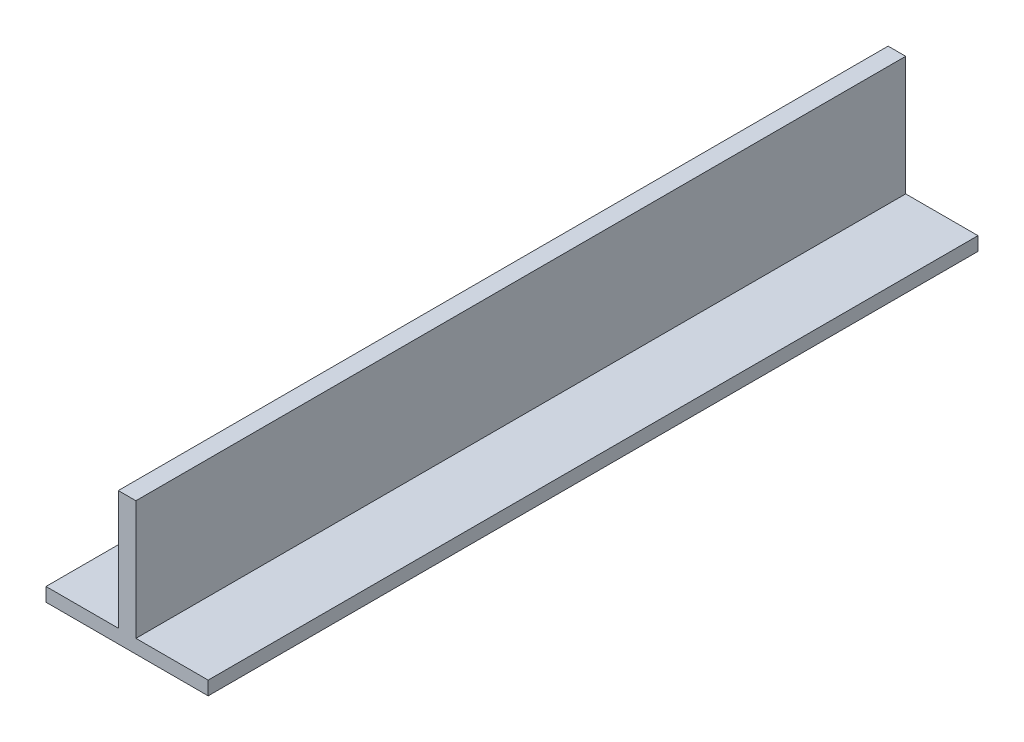
ISO-10303-21;
HEADER;
FILE_DESCRIPTION(('STEP AP214'),'2;1');
FILE_NAME('part.step','',(''),(''),'','','');
FILE_SCHEMA(('AUTOMOTIVE_DESIGN { 1 0 10303 214 1 1 1 1 }'));
ENDSEC;
DATA;
#1=APPLICATION_CONTEXT('core data for automotive mechanical design processes');
#2=APPLICATION_PROTOCOL_DEFINITION('international standard','automotive_design',2000,#1);
#3=PRODUCT_CONTEXT('',#1,'mechanical');
#4=PRODUCT('Part','Part','',(#3));
#5=PRODUCT_RELATED_PRODUCT_CATEGORY('part','',(#4));
#6=PRODUCT_DEFINITION_FORMATION('','',#4);
#7=PRODUCT_DEFINITION_CONTEXT('part definition',#1,'design');
#8=PRODUCT_DEFINITION('design','',#6,#7);
#9=PRODUCT_DEFINITION_SHAPE('','',#8);
#10=(LENGTH_UNIT() NAMED_UNIT(*) SI_UNIT(.MILLI.,.METRE.));
#11=(NAMED_UNIT(*) PLANE_ANGLE_UNIT() SI_UNIT($,.RADIAN.));
#12=(NAMED_UNIT(*) SI_UNIT($,.STERADIAN.) SOLID_ANGLE_UNIT());
#13=UNCERTAINTY_MEASURE_WITH_UNIT(LENGTH_MEASURE(1.E-05),#10,'distance_accuracy_value','');
#14=(GEOMETRIC_REPRESENTATION_CONTEXT(3) GLOBAL_UNCERTAINTY_ASSIGNED_CONTEXT((#13)) GLOBAL_UNIT_ASSIGNED_CONTEXT((#10,
#11,#12)) REPRESENTATION_CONTEXT('',''));
#15=CARTESIAN_POINT('',(0.,0.,0.));
#16=DIRECTION('',(0.,0.,1.));
#17=DIRECTION('',(1.,0.,0.));
#18=AXIS2_PLACEMENT_3D('',#15,#16,#17);
#19=CARTESIAN_POINT('',(0.,7.,394.));
#20=DIRECTION('',(1.,0.,0.));
#21=DIRECTION('',(0.,0.,-1.));
#22=AXIS2_PLACEMENT_3D('',#19,#20,#21);
#23=PLANE('',#22);
#24=DIRECTION('',(0.,-1.,0.));
#25=VECTOR('',#24,1.);
#26=CARTESIAN_POINT('',(0.,7.,0.));
#27=LINE('',#26,#25);
#28=CARTESIAN_POINT('',(0.,7.,0.));
#29=VERTEX_POINT('',#28);
#30=CARTESIAN_POINT('',(0.,0.,0.));
#31=VERTEX_POINT('',#30);
#32=EDGE_CURVE('E128',#29,#31,#27,.T.);
#33=ORIENTED_EDGE('',*,*,#32,.T.);
#34=DIRECTION('',(0.,0.,-1.));
#35=VECTOR('',#34,1.);
#36=CARTESIAN_POINT('',(0.,0.,394.));
#37=LINE('',#36,#35);
#38=CARTESIAN_POINT('',(0.,0.,394.));
#39=VERTEX_POINT('',#38);
#40=EDGE_CURVE('E11',#39,#31,#37,.T.);
#41=ORIENTED_EDGE('',*,*,#40,.F.);
#42=DIRECTION('',(0.,-1.,0.));
#43=VECTOR('',#42,1.);
#44=CARTESIAN_POINT('',(0.,7.,394.));
#45=LINE('',#44,#43);
#46=CARTESIAN_POINT('',(0.,7.,394.));
#47=VERTEX_POINT('',#46);
#48=EDGE_CURVE('E142',#47,#39,#45,.T.);
#49=ORIENTED_EDGE('',*,*,#48,.F.);
#50=DIRECTION('',(0.,0.,-1.));
#51=VECTOR('',#50,1.);
#52=CARTESIAN_POINT('',(0.,7.,394.));
#53=LINE('',#52,#51);
#54=EDGE_CURVE('E124',#47,#29,#53,.T.);
#55=ORIENTED_EDGE('',*,*,#54,.T.);
#56=EDGE_LOOP('',(#33,#41,#49,#55));
#57=FACE_BOUND('',#56,.T.);
#58=ADVANCED_FACE('F32',(#57),#23,.F.);
#59=CARTESIAN_POINT('',(0.,0.,394.));
#60=DIRECTION('',(0.,1.,0.));
#61=DIRECTION('',(0.,0.,1.));
#62=AXIS2_PLACEMENT_3D('',#59,#60,#61);
#63=PLANE('',#62);
#64=DIRECTION('',(1.,0.,0.));
#65=VECTOR('',#64,1.);
#66=CARTESIAN_POINT('',(0.,0.,0.));
#67=LINE('',#66,#65);
#68=CARTESIAN_POINT('',(83.,0.,0.));
#69=VERTEX_POINT('',#68);
#70=EDGE_CURVE('E131',#31,#69,#67,.T.);
#71=ORIENTED_EDGE('',*,*,#70,.T.);
#72=DIRECTION('',(0.,0.,-1.));
#73=VECTOR('',#72,1.);
#74=CARTESIAN_POINT('',(83.,0.,394.));
#75=LINE('',#74,#73);
#76=CARTESIAN_POINT('',(83.,0.,394.));
#77=VERTEX_POINT('',#76);
#78=EDGE_CURVE('E40',#77,#69,#75,.T.);
#79=ORIENTED_EDGE('',*,*,#78,.F.);
#80=DIRECTION('',(1.,0.,0.));
#81=VECTOR('',#80,1.);
#82=CARTESIAN_POINT('',(0.,0.,394.));
#83=LINE('',#82,#81);
#84=EDGE_CURVE('E91',#39,#77,#83,.T.);
#85=ORIENTED_EDGE('',*,*,#84,.F.);
#86=ORIENTED_EDGE('',*,*,#40,.T.);
#87=EDGE_LOOP('',(#71,#79,#85,#86));
#88=FACE_BOUND('',#87,.T.);
#89=ADVANCED_FACE('F177',(#88),#63,.F.);
#90=CARTESIAN_POINT('',(83.,0.,394.));
#91=DIRECTION('',(-1.,0.,0.));
#92=DIRECTION('',(0.,0.,1.));
#93=AXIS2_PLACEMENT_3D('',#90,#91,#92);
#94=PLANE('',#93);
#95=DIRECTION('',(0.,1.,0.));
#96=VECTOR('',#95,1.);
#97=CARTESIAN_POINT('',(83.,0.,0.));
#98=LINE('',#97,#96);
#99=CARTESIAN_POINT('',(83.,7.,0.));
#100=VERTEX_POINT('',#99);
#101=EDGE_CURVE('E133',#69,#100,#98,.T.);
#102=ORIENTED_EDGE('',*,*,#101,.T.);
#103=DIRECTION('',(0.,0.,-1.));
#104=VECTOR('',#103,1.);
#105=CARTESIAN_POINT('',(83.,7.,394.));
#106=LINE('',#105,#104);
#107=CARTESIAN_POINT('',(83.,7.,394.));
#108=VERTEX_POINT('',#107);
#109=EDGE_CURVE('E149',#108,#100,#106,.T.);
#110=ORIENTED_EDGE('',*,*,#109,.F.);
#111=DIRECTION('',(0.,1.,0.));
#112=VECTOR('',#111,1.);
#113=CARTESIAN_POINT('',(83.,0.,394.));
#114=LINE('',#113,#112);
#115=EDGE_CURVE('E157',#77,#108,#114,.T.);
#116=ORIENTED_EDGE('',*,*,#115,.F.);
#117=ORIENTED_EDGE('',*,*,#78,.T.);
#118=EDGE_LOOP('',(#102,#110,#116,#117));
#119=FACE_BOUND('',#118,.T.);
#120=ADVANCED_FACE('F155',(#119),#94,.F.);
#121=CARTESIAN_POINT('',(83.,7.,394.));
#122=DIRECTION('',(0.,-1.,0.));
#123=DIRECTION('',(0.,0.,-1.));
#124=AXIS2_PLACEMENT_3D('',#121,#122,#123);
#125=PLANE('',#124);
#126=DIRECTION('',(-1.,0.,0.));
#127=VECTOR('',#126,1.);
#128=CARTESIAN_POINT('',(83.,7.,0.));
#129=LINE('',#128,#127);
#130=CARTESIAN_POINT('',(46.,7.,0.));
#131=VERTEX_POINT('',#130);
#132=EDGE_CURVE('E135',#100,#131,#129,.T.);
#133=ORIENTED_EDGE('',*,*,#132,.T.);
#134=DIRECTION('',(0.,0.,-1.));
#135=VECTOR('',#134,1.);
#136=CARTESIAN_POINT('',(46.,7.,394.));
#137=LINE('',#136,#135);
#138=CARTESIAN_POINT('',(46.,7.,394.));
#139=VERTEX_POINT('',#138);
#140=EDGE_CURVE('E146',#139,#131,#137,.T.);
#141=ORIENTED_EDGE('',*,*,#140,.F.);
#142=DIRECTION('',(-1.,0.,0.));
#143=VECTOR('',#142,1.);
#144=CARTESIAN_POINT('',(83.,7.,394.));
#145=LINE('',#144,#143);
#146=EDGE_CURVE('E169',#108,#139,#145,.T.);
#147=ORIENTED_EDGE('',*,*,#146,.F.);
#148=ORIENTED_EDGE('',*,*,#109,.T.);
#149=EDGE_LOOP('',(#133,#141,#147,#148));
#150=FACE_BOUND('',#149,.T.);
#151=ADVANCED_FACE('F165',(#150),#125,.F.);
#152=CARTESIAN_POINT('',(46.,7.,394.));
#153=DIRECTION('',(-1.,0.,0.));
#154=DIRECTION('',(0.,-1.,0.));
#155=AXIS2_PLACEMENT_3D('',#152,#153,#154);
#156=PLANE('',#155);
#157=DIRECTION('',(0.,1.,0.));
#158=VECTOR('',#157,1.);
#159=CARTESIAN_POINT('',(46.,7.,0.));
#160=LINE('',#159,#158);
#161=CARTESIAN_POINT('',(46.,68.,0.));
#162=VERTEX_POINT('',#161);
#163=EDGE_CURVE('E137',#131,#162,#160,.T.);
#164=ORIENTED_EDGE('',*,*,#163,.T.);
#165=DIRECTION('',(0.,0.,-1.));
#166=VECTOR('',#165,1.);
#167=CARTESIAN_POINT('',(46.,68.,394.));
#168=LINE('',#167,#166);
#169=CARTESIAN_POINT('',(46.,68.,394.));
#170=VERTEX_POINT('',#169);
#171=EDGE_CURVE('E119',#170,#162,#168,.T.);
#172=ORIENTED_EDGE('',*,*,#171,.F.);
#173=DIRECTION('',(0.,1.,0.));
#174=VECTOR('',#173,1.);
#175=CARTESIAN_POINT('',(46.,7.,394.));
#176=LINE('',#175,#174);
#177=EDGE_CURVE('E110',#139,#170,#176,.T.);
#178=ORIENTED_EDGE('',*,*,#177,.F.);
#179=ORIENTED_EDGE('',*,*,#140,.T.);
#180=EDGE_LOOP('',(#164,#172,#178,#179));
#181=FACE_BOUND('',#180,.T.);
#182=ADVANCED_FACE('F168',(#181),#156,.F.);
#183=CARTESIAN_POINT('',(46.,68.,394.));
#184=DIRECTION('',(0.,-1.,0.));
#185=DIRECTION('',(0.,0.,-1.));
#186=AXIS2_PLACEMENT_3D('',#183,#184,#185);
#187=PLANE('',#186);
#188=DIRECTION('',(-1.,0.,0.));
#189=VECTOR('',#188,1.);
#190=CARTESIAN_POINT('',(46.,68.,0.));
#191=LINE('',#190,#189);
#192=CARTESIAN_POINT('',(37.,68.,0.));
#193=VERTEX_POINT('',#192);
#194=EDGE_CURVE('E118',#162,#193,#191,.T.);
#195=ORIENTED_EDGE('',*,*,#194,.T.);
#196=DIRECTION('',(0.,0.,-1.));
#197=VECTOR('',#196,1.);
#198=CARTESIAN_POINT('',(37.,68.,394.));
#199=LINE('',#198,#197);
#200=CARTESIAN_POINT('',(37.,68.,394.));
#201=VERTEX_POINT('',#200);
#202=EDGE_CURVE('E115',#201,#193,#199,.T.);
#203=ORIENTED_EDGE('',*,*,#202,.F.);
#204=DIRECTION('',(-1.,0.,0.));
#205=VECTOR('',#204,1.);
#206=CARTESIAN_POINT('',(46.,68.,394.));
#207=LINE('',#206,#205);
#208=EDGE_CURVE('E104',#170,#201,#207,.T.);
#209=ORIENTED_EDGE('',*,*,#208,.F.);
#210=ORIENTED_EDGE('',*,*,#171,.T.);
#211=EDGE_LOOP('',(#195,#203,#209,#210));
#212=FACE_BOUND('',#211,.T.);
#213=ADVANCED_FACE('F116',(#212),#187,.F.);
#214=CARTESIAN_POINT('',(37.,68.,394.));
#215=DIRECTION('',(1.,0.,0.));
#216=DIRECTION('',(0.,0.,-1.));
#217=AXIS2_PLACEMENT_3D('',#214,#215,#216);
#218=PLANE('',#217);
#219=DIRECTION('',(0.,-1.,0.));
#220=VECTOR('',#219,1.);
#221=CARTESIAN_POINT('',(37.,68.,0.));
#222=LINE('',#221,#220);
#223=CARTESIAN_POINT('',(37.,7.,0.));
#224=VERTEX_POINT('',#223);
#225=EDGE_CURVE('E77',#193,#224,#222,.T.);
#226=ORIENTED_EDGE('',*,*,#225,.T.);
#227=DIRECTION('',(0.,0.,-1.));
#228=VECTOR('',#227,1.);
#229=CARTESIAN_POINT('',(37.,7.,394.));
#230=LINE('',#229,#228);
#231=CARTESIAN_POINT('',(37.,7.,394.));
#232=VERTEX_POINT('',#231);
#233=EDGE_CURVE('E120',#232,#224,#230,.T.);
#234=ORIENTED_EDGE('',*,*,#233,.F.);
#235=DIRECTION('',(0.,-1.,0.));
#236=VECTOR('',#235,1.);
#237=CARTESIAN_POINT('',(37.,68.,394.));
#238=LINE('',#237,#236);
#239=EDGE_CURVE('E108',#201,#232,#238,.T.);
#240=ORIENTED_EDGE('',*,*,#239,.F.);
#241=ORIENTED_EDGE('',*,*,#202,.T.);
#242=EDGE_LOOP('',(#226,#234,#240,#241));
#243=FACE_BOUND('',#242,.T.);
#244=ADVANCED_FACE('F122',(#243),#218,.F.);
#245=CARTESIAN_POINT('',(37.,7.,394.));
#246=DIRECTION('',(0.,-1.,0.));
#247=DIRECTION('',(1.,0.,0.));
#248=AXIS2_PLACEMENT_3D('',#245,#246,#247);
#249=PLANE('',#248);
#250=DIRECTION('',(-1.,0.,0.));
#251=VECTOR('',#250,1.);
#252=CARTESIAN_POINT('',(37.,7.,0.));
#253=LINE('',#252,#251);
#254=EDGE_CURVE('E83',#224,#29,#253,.T.);
#255=ORIENTED_EDGE('',*,*,#254,.T.);
#256=ORIENTED_EDGE('',*,*,#54,.F.);
#257=DIRECTION('',(-1.,0.,0.));
#258=VECTOR('',#257,1.);
#259=CARTESIAN_POINT('',(37.,7.,394.));
#260=LINE('',#259,#258);
#261=EDGE_CURVE('E48',#232,#47,#260,.T.);
#262=ORIENTED_EDGE('',*,*,#261,.F.);
#263=ORIENTED_EDGE('',*,*,#233,.T.);
#264=EDGE_LOOP('',(#255,#256,#262,#263));
#265=FACE_BOUND('',#264,.T.);
#266=ADVANCED_FACE('F193',(#265),#249,.F.);
#267=CARTESIAN_POINT('',(0.,0.,394.));
#268=DIRECTION('',(0.,0.,1.));
#269=DIRECTION('',(1.,0.,0.));
#270=AXIS2_PLACEMENT_3D('',#267,#268,#269);
#271=PLANE('',#270);
#272=ORIENTED_EDGE('',*,*,#48,.T.);
#273=ORIENTED_EDGE('',*,*,#84,.T.);
#274=ORIENTED_EDGE('',*,*,#115,.T.);
#275=ORIENTED_EDGE('',*,*,#146,.T.);
#276=ORIENTED_EDGE('',*,*,#177,.T.);
#277=ORIENTED_EDGE('',*,*,#208,.T.);
#278=ORIENTED_EDGE('',*,*,#239,.T.);
#279=ORIENTED_EDGE('',*,*,#261,.T.);
#280=EDGE_LOOP('',(#272,#273,#274,#275,#276,#277,#278,#279));
#281=FACE_BOUND('',#280,.T.);
#282=ADVANCED_FACE('F106',(#281),#271,.T.);
#283=CARTESIAN_POINT('',(0.,0.,0.));
#284=DIRECTION('',(0.,0.,1.));
#285=DIRECTION('',(1.,0.,0.));
#286=AXIS2_PLACEMENT_3D('',#283,#284,#285);
#287=PLANE('',#286);
#288=ORIENTED_EDGE('',*,*,#32,.F.);
#289=ORIENTED_EDGE('',*,*,#254,.F.);
#290=ORIENTED_EDGE('',*,*,#225,.F.);
#291=ORIENTED_EDGE('',*,*,#194,.F.);
#292=ORIENTED_EDGE('',*,*,#163,.F.);
#293=ORIENTED_EDGE('',*,*,#132,.F.);
#294=ORIENTED_EDGE('',*,*,#101,.F.);
#295=ORIENTED_EDGE('',*,*,#70,.F.);
#296=EDGE_LOOP('',(#288,#289,#290,#291,#292,#293,#294,#295));
#297=FACE_BOUND('',#296,.T.);
#298=ADVANCED_FACE('F161',(#297),#287,.F.);
#299=CLOSED_SHELL('',(#58,#89,#120,#151,#182,#213,#244,#266,#282,#298));
#300=MANIFOLD_SOLID_BREP('B2',#299);
#301=ADVANCED_BREP_SHAPE_REPRESENTATION('',(#18,#300),#14);
#302=SHAPE_DEFINITION_REPRESENTATION(#9,#301);
ENDSEC;
END-ISO-10303-21;
